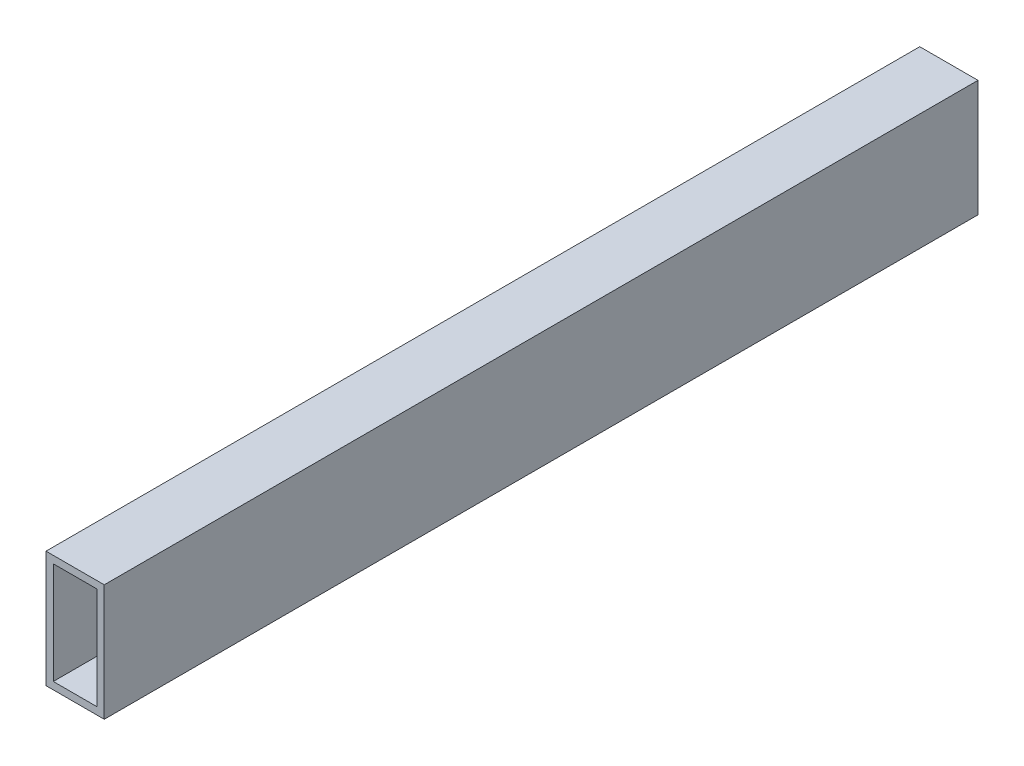
ISO-10303-21;
HEADER;
FILE_DESCRIPTION(('STEP AP214'),'2;1');
FILE_NAME('part.step','',(''),(''),'','','');
FILE_SCHEMA(('AUTOMOTIVE_DESIGN { 1 0 10303 214 1 1 1 1 }'));
ENDSEC;
DATA;
#1=APPLICATION_CONTEXT('core data for automotive mechanical design processes');
#2=APPLICATION_PROTOCOL_DEFINITION('international standard','automotive_design',2000,#1);
#3=PRODUCT_CONTEXT('',#1,'mechanical');
#4=PRODUCT('Part','Part','',(#3));
#5=PRODUCT_RELATED_PRODUCT_CATEGORY('part','',(#4));
#6=PRODUCT_DEFINITION_FORMATION('','',#4);
#7=PRODUCT_DEFINITION_CONTEXT('part definition',#1,'design');
#8=PRODUCT_DEFINITION('design','',#6,#7);
#9=PRODUCT_DEFINITION_SHAPE('','',#8);
#10=(LENGTH_UNIT() NAMED_UNIT(*) SI_UNIT(.MILLI.,.METRE.));
#11=(NAMED_UNIT(*) PLANE_ANGLE_UNIT() SI_UNIT($,.RADIAN.));
#12=(NAMED_UNIT(*) SI_UNIT($,.STERADIAN.) SOLID_ANGLE_UNIT());
#13=UNCERTAINTY_MEASURE_WITH_UNIT(LENGTH_MEASURE(1.E-05),#10,'distance_accuracy_value','');
#14=(GEOMETRIC_REPRESENTATION_CONTEXT(3) GLOBAL_UNCERTAINTY_ASSIGNED_CONTEXT((#13)) GLOBAL_UNIT_ASSIGNED_CONTEXT((#10,
#11,#12)) REPRESENTATION_CONTEXT('',''));
#15=CARTESIAN_POINT('',(0.,0.,0.));
#16=DIRECTION('',(0.,0.,1.));
#17=DIRECTION('',(1.,0.,0.));
#18=AXIS2_PLACEMENT_3D('',#15,#16,#17);
#19=CARTESIAN_POINT('',(0.,0.,190.5));
#20=DIRECTION('',(0.,0.,-1.));
#21=DIRECTION('',(-1.,0.,0.));
#22=AXIS2_PLACEMENT_3D('',#19,#20,#21);
#23=PLANE('',#22);
#24=DIRECTION('',(0.,1.,0.));
#25=VECTOR('',#24,1.);
#26=CARTESIAN_POINT('',(12.7,-25.4,190.5));
#27=LINE('',#26,#25);
#28=CARTESIAN_POINT('',(12.7,-25.4,190.5));
#29=VERTEX_POINT('',#28);
#30=CARTESIAN_POINT('',(12.7,25.4,190.5));
#31=VERTEX_POINT('',#30);
#32=EDGE_CURVE('E134',#29,#31,#27,.T.);
#33=ORIENTED_EDGE('',*,*,#32,.T.);
#34=DIRECTION('',(-1.,0.,0.));
#35=VECTOR('',#34,1.);
#36=CARTESIAN_POINT('',(-12.7,25.4,190.5));
#37=LINE('',#36,#35);
#38=CARTESIAN_POINT('',(-12.7,25.4,190.5));
#39=VERTEX_POINT('',#38);
#40=EDGE_CURVE('E137',#31,#39,#37,.T.);
#41=ORIENTED_EDGE('',*,*,#40,.T.);
#42=DIRECTION('',(0.,-1.,0.));
#43=VECTOR('',#42,1.);
#44=CARTESIAN_POINT('',(-12.7,-25.4,190.5));
#45=LINE('',#44,#43);
#46=CARTESIAN_POINT('',(-12.7,-25.4,190.5));
#47=VERTEX_POINT('',#46);
#48=EDGE_CURVE('E140',#39,#47,#45,.T.);
#49=ORIENTED_EDGE('',*,*,#48,.T.);
#50=DIRECTION('',(1.,0.,0.));
#51=VECTOR('',#50,1.);
#52=CARTESIAN_POINT('',(-12.7,-25.4,190.5));
#53=LINE('',#52,#51);
#54=EDGE_CURVE('E142',#47,#29,#53,.T.);
#55=ORIENTED_EDGE('',*,*,#54,.T.);
#56=EDGE_LOOP('',(#33,#41,#49,#55));
#57=FACE_BOUND('',#56,.T.);
#58=DIRECTION('',(0.,1.,0.));
#59=VECTOR('',#58,1.);
#60=CARTESIAN_POINT('',(9.525,-22.225,190.5));
#61=LINE('',#60,#59);
#62=CARTESIAN_POINT('',(9.525,-22.225,190.5));
#63=VERTEX_POINT('',#62);
#64=CARTESIAN_POINT('',(9.525,22.225,190.5));
#65=VERTEX_POINT('',#64);
#66=EDGE_CURVE('E98',#63,#65,#61,.T.);
#67=ORIENTED_EDGE('',*,*,#66,.F.);
#68=DIRECTION('',(1.,0.,0.));
#69=VECTOR('',#68,1.);
#70=CARTESIAN_POINT('',(-9.525,-22.225,190.5));
#71=LINE('',#70,#69);
#72=CARTESIAN_POINT('',(-9.525,-22.225,190.5));
#73=VERTEX_POINT('',#72);
#74=EDGE_CURVE('E120',#73,#63,#71,.T.);
#75=ORIENTED_EDGE('',*,*,#74,.F.);
#76=DIRECTION('',(0.,-1.,0.));
#77=VECTOR('',#76,1.);
#78=CARTESIAN_POINT('',(-9.525,-22.225,190.5));
#79=LINE('',#78,#77);
#80=CARTESIAN_POINT('',(-9.525,22.225,190.5));
#81=VERTEX_POINT('',#80);
#82=EDGE_CURVE('E118',#81,#73,#79,.T.);
#83=ORIENTED_EDGE('',*,*,#82,.F.);
#84=DIRECTION('',(-1.,0.,0.));
#85=VECTOR('',#84,1.);
#86=CARTESIAN_POINT('',(-9.525,22.225,190.5));
#87=LINE('',#86,#85);
#88=EDGE_CURVE('E106',#65,#81,#87,.T.);
#89=ORIENTED_EDGE('',*,*,#88,.F.);
#90=EDGE_LOOP('',(#67,#75,#83,#89));
#91=FACE_BOUND('',#90,.T.);
#92=ADVANCED_FACE('F33',(#57,#91),#23,.F.);
#93=CARTESIAN_POINT('',(0.,0.,-190.5));
#94=DIRECTION('',(0.,0.,-1.));
#95=DIRECTION('',(-1.,0.,0.));
#96=AXIS2_PLACEMENT_3D('',#93,#94,#95);
#97=PLANE('',#96);
#98=DIRECTION('',(0.,1.,0.));
#99=VECTOR('',#98,1.);
#100=CARTESIAN_POINT('',(12.7,-25.4,-190.5));
#101=LINE('',#100,#99);
#102=CARTESIAN_POINT('',(12.7,-25.4,-190.5));
#103=VERTEX_POINT('',#102);
#104=CARTESIAN_POINT('',(12.7,25.4,-190.5));
#105=VERTEX_POINT('',#104);
#106=EDGE_CURVE('E114',#103,#105,#101,.T.);
#107=ORIENTED_EDGE('',*,*,#106,.F.);
#108=DIRECTION('',(1.,0.,0.));
#109=VECTOR('',#108,1.);
#110=CARTESIAN_POINT('',(-12.7,-25.4,-190.5));
#111=LINE('',#110,#109);
#112=CARTESIAN_POINT('',(-12.7,-25.4,-190.5));
#113=VERTEX_POINT('',#112);
#114=EDGE_CURVE('E138',#113,#103,#111,.T.);
#115=ORIENTED_EDGE('',*,*,#114,.F.);
#116=DIRECTION('',(0.,-1.,0.));
#117=VECTOR('',#116,1.);
#118=CARTESIAN_POINT('',(-12.7,-25.4,-190.5));
#119=LINE('',#118,#117);
#120=CARTESIAN_POINT('',(-12.7,25.4,-190.5));
#121=VERTEX_POINT('',#120);
#122=EDGE_CURVE('E149',#121,#113,#119,.T.);
#123=ORIENTED_EDGE('',*,*,#122,.F.);
#124=DIRECTION('',(-1.,0.,0.));
#125=VECTOR('',#124,1.);
#126=CARTESIAN_POINT('',(-12.7,25.4,-190.5));
#127=LINE('',#126,#125);
#128=EDGE_CURVE('E147',#105,#121,#127,.T.);
#129=ORIENTED_EDGE('',*,*,#128,.F.);
#130=EDGE_LOOP('',(#107,#115,#123,#129));
#131=FACE_BOUND('',#130,.T.);
#132=DIRECTION('',(1.,0.,0.));
#133=VECTOR('',#132,1.);
#134=CARTESIAN_POINT('',(-9.525,-22.225,-190.5));
#135=LINE('',#134,#133);
#136=CARTESIAN_POINT('',(-9.525,-22.225,-190.5));
#137=VERTEX_POINT('',#136);
#138=CARTESIAN_POINT('',(9.525,-22.225,-190.5));
#139=VERTEX_POINT('',#138);
#140=EDGE_CURVE('E107',#137,#139,#135,.T.);
#141=ORIENTED_EDGE('',*,*,#140,.T.);
#142=DIRECTION('',(0.,1.,0.));
#143=VECTOR('',#142,1.);
#144=CARTESIAN_POINT('',(9.525,-22.225,-190.5));
#145=LINE('',#144,#143);
#146=CARTESIAN_POINT('',(9.525,22.225,-190.5));
#147=VERTEX_POINT('',#146);
#148=EDGE_CURVE('E56',#139,#147,#145,.T.);
#149=ORIENTED_EDGE('',*,*,#148,.T.);
#150=DIRECTION('',(-1.,0.,0.));
#151=VECTOR('',#150,1.);
#152=CARTESIAN_POINT('',(-9.525,22.225,-190.5));
#153=LINE('',#152,#151);
#154=CARTESIAN_POINT('',(-9.525,22.225,-190.5));
#155=VERTEX_POINT('',#154);
#156=EDGE_CURVE('E113',#147,#155,#153,.T.);
#157=ORIENTED_EDGE('',*,*,#156,.T.);
#158=DIRECTION('',(0.,-1.,0.));
#159=VECTOR('',#158,1.);
#160=CARTESIAN_POINT('',(-9.525,-22.225,-190.5));
#161=LINE('',#160,#159);
#162=EDGE_CURVE('E126',#155,#137,#161,.T.);
#163=ORIENTED_EDGE('',*,*,#162,.T.);
#164=EDGE_LOOP('',(#141,#149,#157,#163));
#165=FACE_BOUND('',#164,.T.);
#166=ADVANCED_FACE('F167',(#131,#165),#97,.T.);
#167=CARTESIAN_POINT('',(12.7,-25.4,190.5));
#168=DIRECTION('',(-1.,0.,0.));
#169=DIRECTION('',(0.,0.,1.));
#170=AXIS2_PLACEMENT_3D('',#167,#168,#169);
#171=PLANE('',#170);
#172=ORIENTED_EDGE('',*,*,#106,.T.);
#173=DIRECTION('',(0.,0.,-1.));
#174=VECTOR('',#173,1.);
#175=CARTESIAN_POINT('',(12.7,25.4,190.5));
#176=LINE('',#175,#174);
#177=EDGE_CURVE('E11',#31,#105,#176,.T.);
#178=ORIENTED_EDGE('',*,*,#177,.F.);
#179=ORIENTED_EDGE('',*,*,#32,.F.);
#180=DIRECTION('',(0.,0.,-1.));
#181=VECTOR('',#180,1.);
#182=CARTESIAN_POINT('',(12.7,-25.4,190.5));
#183=LINE('',#182,#181);
#184=EDGE_CURVE('E144',#29,#103,#183,.T.);
#185=ORIENTED_EDGE('',*,*,#184,.T.);
#186=EDGE_LOOP('',(#172,#178,#179,#185));
#187=FACE_BOUND('',#186,.T.);
#188=ADVANCED_FACE('F35',(#187),#171,.F.);
#189=CARTESIAN_POINT('',(-12.7,25.4,190.5));
#190=DIRECTION('',(0.,-1.,0.));
#191=DIRECTION('',(0.,0.,-1.));
#192=AXIS2_PLACEMENT_3D('',#189,#190,#191);
#193=PLANE('',#192);
#194=ORIENTED_EDGE('',*,*,#128,.T.);
#195=DIRECTION('',(0.,0.,-1.));
#196=VECTOR('',#195,1.);
#197=CARTESIAN_POINT('',(-12.7,25.4,190.5));
#198=LINE('',#197,#196);
#199=EDGE_CURVE('E41',#39,#121,#198,.T.);
#200=ORIENTED_EDGE('',*,*,#199,.F.);
#201=ORIENTED_EDGE('',*,*,#40,.F.);
#202=ORIENTED_EDGE('',*,*,#177,.T.);
#203=EDGE_LOOP('',(#194,#200,#201,#202));
#204=FACE_BOUND('',#203,.T.);
#205=ADVANCED_FACE('F177',(#204),#193,.F.);
#206=CARTESIAN_POINT('',(-12.7,-25.4,190.5));
#207=DIRECTION('',(1.,0.,0.));
#208=DIRECTION('',(0.,0.,-1.));
#209=AXIS2_PLACEMENT_3D('',#206,#207,#208);
#210=PLANE('',#209);
#211=ORIENTED_EDGE('',*,*,#122,.T.);
#212=DIRECTION('',(0.,0.,-1.));
#213=VECTOR('',#212,1.);
#214=CARTESIAN_POINT('',(-12.7,-25.4,190.5));
#215=LINE('',#214,#213);
#216=EDGE_CURVE('E154',#47,#113,#215,.T.);
#217=ORIENTED_EDGE('',*,*,#216,.F.);
#218=ORIENTED_EDGE('',*,*,#48,.F.);
#219=ORIENTED_EDGE('',*,*,#199,.T.);
#220=EDGE_LOOP('',(#211,#217,#218,#219));
#221=FACE_BOUND('',#220,.T.);
#222=ADVANCED_FACE('F161',(#221),#210,.F.);
#223=CARTESIAN_POINT('',(-12.7,-25.4,190.5));
#224=DIRECTION('',(0.,1.,0.));
#225=DIRECTION('',(0.,0.,1.));
#226=AXIS2_PLACEMENT_3D('',#223,#224,#225);
#227=PLANE('',#226);
#228=ORIENTED_EDGE('',*,*,#114,.T.);
#229=ORIENTED_EDGE('',*,*,#184,.F.);
#230=ORIENTED_EDGE('',*,*,#54,.F.);
#231=ORIENTED_EDGE('',*,*,#216,.T.);
#232=EDGE_LOOP('',(#228,#229,#230,#231));
#233=FACE_BOUND('',#232,.T.);
#234=ADVANCED_FACE('F171',(#233),#227,.F.);
#235=CARTESIAN_POINT('',(9.525,-22.225,190.5));
#236=DIRECTION('',(-1.,0.,0.));
#237=DIRECTION('',(0.,0.,1.));
#238=AXIS2_PLACEMENT_3D('',#235,#236,#237);
#239=PLANE('',#238);
#240=ORIENTED_EDGE('',*,*,#148,.F.);
#241=DIRECTION('',(0.,0.,-1.));
#242=VECTOR('',#241,1.);
#243=CARTESIAN_POINT('',(9.525,-22.225,190.5));
#244=LINE('',#243,#242);
#245=EDGE_CURVE('E102',#63,#139,#244,.T.);
#246=ORIENTED_EDGE('',*,*,#245,.F.);
#247=ORIENTED_EDGE('',*,*,#66,.T.);
#248=DIRECTION('',(0.,0.,-1.));
#249=VECTOR('',#248,1.);
#250=CARTESIAN_POINT('',(9.525,22.225,190.5));
#251=LINE('',#250,#249);
#252=EDGE_CURVE('E101',#65,#147,#251,.T.);
#253=ORIENTED_EDGE('',*,*,#252,.T.);
#254=EDGE_LOOP('',(#240,#246,#247,#253));
#255=FACE_BOUND('',#254,.T.);
#256=ADVANCED_FACE('F100',(#255),#239,.T.);
#257=CARTESIAN_POINT('',(-9.525,22.225,190.5));
#258=DIRECTION('',(0.,-1.,0.));
#259=DIRECTION('',(0.,0.,-1.));
#260=AXIS2_PLACEMENT_3D('',#257,#258,#259);
#261=PLANE('',#260);
#262=ORIENTED_EDGE('',*,*,#156,.F.);
#263=ORIENTED_EDGE('',*,*,#252,.F.);
#264=ORIENTED_EDGE('',*,*,#88,.T.);
#265=DIRECTION('',(0.,0.,-1.));
#266=VECTOR('',#265,1.);
#267=CARTESIAN_POINT('',(-9.525,22.225,190.5));
#268=LINE('',#267,#266);
#269=EDGE_CURVE('E115',#81,#155,#268,.T.);
#270=ORIENTED_EDGE('',*,*,#269,.T.);
#271=EDGE_LOOP('',(#262,#263,#264,#270));
#272=FACE_BOUND('',#271,.T.);
#273=ADVANCED_FACE('F110',(#272),#261,.T.);
#274=CARTESIAN_POINT('',(-9.525,-22.225,190.5));
#275=DIRECTION('',(1.,0.,0.));
#276=DIRECTION('',(0.,0.,-1.));
#277=AXIS2_PLACEMENT_3D('',#274,#275,#276);
#278=PLANE('',#277);
#279=ORIENTED_EDGE('',*,*,#162,.F.);
#280=ORIENTED_EDGE('',*,*,#269,.F.);
#281=ORIENTED_EDGE('',*,*,#82,.T.);
#282=DIRECTION('',(0.,0.,-1.));
#283=VECTOR('',#282,1.);
#284=CARTESIAN_POINT('',(-9.525,-22.225,190.5));
#285=LINE('',#284,#283);
#286=EDGE_CURVE('E48',#73,#137,#285,.T.);
#287=ORIENTED_EDGE('',*,*,#286,.T.);
#288=EDGE_LOOP('',(#279,#280,#281,#287));
#289=FACE_BOUND('',#288,.T.);
#290=ADVANCED_FACE('F200',(#289),#278,.T.);
#291=CARTESIAN_POINT('',(-9.525,-22.225,190.5));
#292=DIRECTION('',(0.,1.,0.));
#293=DIRECTION('',(0.,0.,1.));
#294=AXIS2_PLACEMENT_3D('',#291,#292,#293);
#295=PLANE('',#294);
#296=ORIENTED_EDGE('',*,*,#140,.F.);
#297=ORIENTED_EDGE('',*,*,#286,.F.);
#298=ORIENTED_EDGE('',*,*,#74,.T.);
#299=ORIENTED_EDGE('',*,*,#245,.T.);
#300=EDGE_LOOP('',(#296,#297,#298,#299));
#301=FACE_BOUND('',#300,.T.);
#302=ADVANCED_FACE('F204',(#301),#295,.T.);
#303=CLOSED_SHELL('',(#92,#166,#188,#205,#222,#234,#256,#273,#290,#302));
#304=MANIFOLD_SOLID_BREP('B2',#303);
#305=ADVANCED_BREP_SHAPE_REPRESENTATION('',(#18,#304),#14);
#306=SHAPE_DEFINITION_REPRESENTATION(#9,#305);
ENDSEC;
END-ISO-10303-21;
